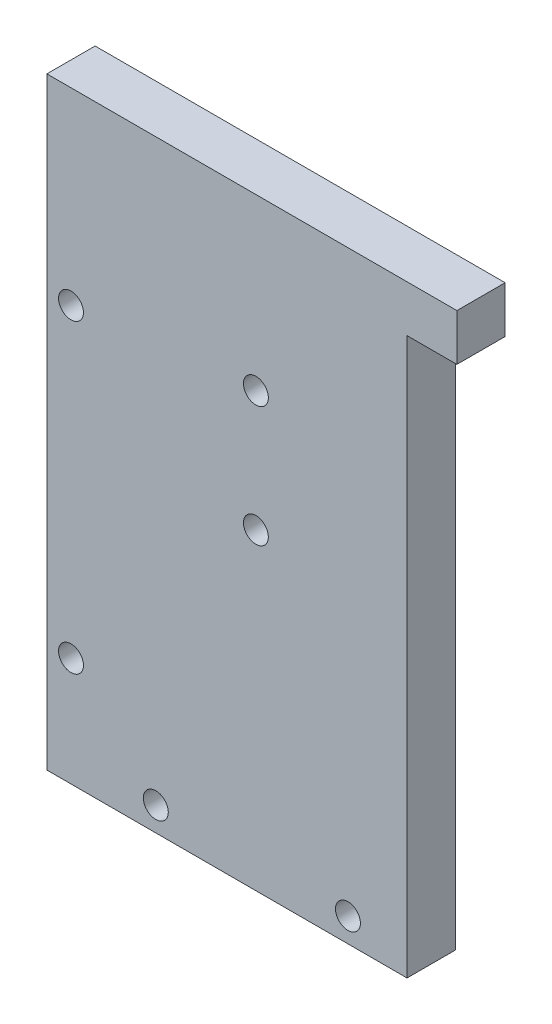
ISO-10303-21;
HEADER;
FILE_DESCRIPTION(('STEP AP214'),'2;1');
FILE_NAME('part.step','',(''),(''),'','','');
FILE_SCHEMA(('AUTOMOTIVE_DESIGN { 1 0 10303 214 1 1 1 1 }'));
ENDSEC;
DATA;
#1=APPLICATION_CONTEXT('core data for automotive mechanical design processes');
#2=APPLICATION_PROTOCOL_DEFINITION('international standard','automotive_design',2000,#1);
#3=PRODUCT_CONTEXT('',#1,'mechanical');
#4=PRODUCT('Part','Part','',(#3));
#5=PRODUCT_RELATED_PRODUCT_CATEGORY('part','',(#4));
#6=PRODUCT_DEFINITION_FORMATION('','',#4);
#7=PRODUCT_DEFINITION_CONTEXT('part definition',#1,'design');
#8=PRODUCT_DEFINITION('design','',#6,#7);
#9=PRODUCT_DEFINITION_SHAPE('','',#8);
#10=(LENGTH_UNIT() NAMED_UNIT(*) SI_UNIT(.MILLI.,.METRE.));
#11=(NAMED_UNIT(*) PLANE_ANGLE_UNIT() SI_UNIT($,.RADIAN.));
#12=(NAMED_UNIT(*) SI_UNIT($,.STERADIAN.) SOLID_ANGLE_UNIT());
#13=UNCERTAINTY_MEASURE_WITH_UNIT(LENGTH_MEASURE(1.E-05),#10,'distance_accuracy_value','');
#14=(GEOMETRIC_REPRESENTATION_CONTEXT(3) GLOBAL_UNCERTAINTY_ASSIGNED_CONTEXT((#13)) GLOBAL_UNIT_ASSIGNED_CONTEXT((#10,
#11,#12)) REPRESENTATION_CONTEXT('',''));
#15=CARTESIAN_POINT('',(0.,0.,0.));
#16=DIRECTION('',(0.,0.,1.));
#17=DIRECTION('',(1.,0.,0.));
#18=AXIS2_PLACEMENT_3D('',#15,#16,#17);
#19=CARTESIAN_POINT('',(55.4911815855497,81.,6.));
#20=DIRECTION('',(-1.,0.,0.));
#21=DIRECTION('',(0.,-1.,0.));
#22=AXIS2_PLACEMENT_3D('',#19,#20,#21);
#23=PLANE('',#22);
#24=DIRECTION('',(0.,1.,0.));
#25=VECTOR('',#24,1.);
#26=CARTESIAN_POINT('',(55.4911815855497,81.,6.));
#27=LINE('',#26,#25);
#28=CARTESIAN_POINT('',(55.4911815855497,75.2,6.));
#29=VERTEX_POINT('',#28);
#30=CARTESIAN_POINT('',(55.4911815855497,81.,6.));
#31=VERTEX_POINT('',#30);
#32=EDGE_CURVE('E78',#29,#31,#27,.T.);
#33=ORIENTED_EDGE('',*,*,#32,.F.);
#34=DIRECTION('',(0.,0.,-1.));
#35=VECTOR('',#34,1.);
#36=CARTESIAN_POINT('',(55.4911815855497,75.2,6.));
#37=LINE('',#36,#35);
#38=CARTESIAN_POINT('',(55.4911815855497,75.2,0.));
#39=VERTEX_POINT('',#38);
#40=EDGE_CURVE('E117',#29,#39,#37,.T.);
#41=ORIENTED_EDGE('',*,*,#40,.T.);
#42=DIRECTION('',(0.,1.,0.));
#43=VECTOR('',#42,1.);
#44=CARTESIAN_POINT('',(55.4911815855497,81.,0.));
#45=LINE('',#44,#43);
#46=CARTESIAN_POINT('',(55.4911815855497,81.,0.));
#47=VERTEX_POINT('',#46);
#48=EDGE_CURVE('E111',#39,#47,#45,.T.);
#49=ORIENTED_EDGE('',*,*,#48,.T.);
#50=DIRECTION('',(0.,0.,-1.));
#51=VECTOR('',#50,1.);
#52=CARTESIAN_POINT('',(55.4911815855497,81.,6.));
#53=LINE('',#52,#51);
#54=EDGE_CURVE('E41',#31,#47,#53,.T.);
#55=ORIENTED_EDGE('',*,*,#54,.F.);
#56=EDGE_LOOP('',(#33,#41,#49,#55));
#57=FACE_BOUND('',#56,.T.);
#58=ADVANCED_FACE('F34',(#57),#23,.F.);
#59=CARTESIAN_POINT('',(4.49118158554994,81.,6.));
#60=DIRECTION('',(0.,-1.,0.));
#61=DIRECTION('',(0.,0.,-1.));
#62=AXIS2_PLACEMENT_3D('',#59,#60,#61);
#63=PLANE('',#62);
#64=DIRECTION('',(-1.,0.,0.));
#65=VECTOR('',#64,1.);
#66=CARTESIAN_POINT('',(4.49118158554994,81.,0.));
#67=LINE('',#66,#65);
#68=CARTESIAN_POINT('',(4.49118158554994,81.,0.));
#69=VERTEX_POINT('',#68);
#70=EDGE_CURVE('E164',#47,#69,#67,.T.);
#71=ORIENTED_EDGE('',*,*,#70,.T.);
#72=DIRECTION('',(0.,0.,-1.));
#73=VECTOR('',#72,1.);
#74=CARTESIAN_POINT('',(4.49118158554994,81.,6.));
#75=LINE('',#74,#73);
#76=CARTESIAN_POINT('',(4.49118158554994,81.,6.));
#77=VERTEX_POINT('',#76);
#78=EDGE_CURVE('E169',#77,#69,#75,.T.);
#79=ORIENTED_EDGE('',*,*,#78,.F.);
#80=DIRECTION('',(-1.,0.,0.));
#81=VECTOR('',#80,1.);
#82=CARTESIAN_POINT('',(4.49118158554994,81.,6.));
#83=LINE('',#82,#81);
#84=EDGE_CURVE('E156',#31,#77,#83,.T.);
#85=ORIENTED_EDGE('',*,*,#84,.F.);
#86=ORIENTED_EDGE('',*,*,#54,.T.);
#87=EDGE_LOOP('',(#71,#79,#85,#86));
#88=FACE_BOUND('',#87,.T.);
#89=ADVANCED_FACE('F173',(#88),#63,.F.);
#90=CARTESIAN_POINT('',(4.49118158554994,5.99999999999996,6.));
#91=DIRECTION('',(1.,0.,0.));
#92=DIRECTION('',(0.,0.,-1.));
#93=AXIS2_PLACEMENT_3D('',#90,#91,#92);
#94=PLANE('',#93);
#95=DIRECTION('',(0.,-1.,0.));
#96=VECTOR('',#95,1.);
#97=CARTESIAN_POINT('',(4.49118158554994,5.99999999999996,0.));
#98=LINE('',#97,#96);
#99=CARTESIAN_POINT('',(4.49118158554994,5.99999999999996,0.));
#100=VERTEX_POINT('',#99);
#101=EDGE_CURVE('E73',#69,#100,#98,.T.);
#102=ORIENTED_EDGE('',*,*,#101,.T.);
#103=DIRECTION('',(0.,0.,-1.));
#104=VECTOR('',#103,1.);
#105=CARTESIAN_POINT('',(4.49118158554994,5.99999999999996,6.));
#106=LINE('',#105,#104);
#107=CARTESIAN_POINT('',(4.49118158554994,5.99999999999996,6.));
#108=VERTEX_POINT('',#107);
#109=EDGE_CURVE('E162',#108,#100,#106,.T.);
#110=ORIENTED_EDGE('',*,*,#109,.F.);
#111=DIRECTION('',(0.,-1.,0.));
#112=VECTOR('',#111,1.);
#113=CARTESIAN_POINT('',(4.49118158554994,5.99999999999996,6.));
#114=LINE('',#113,#112);
#115=EDGE_CURVE('E56',#77,#108,#114,.T.);
#116=ORIENTED_EDGE('',*,*,#115,.F.);
#117=ORIENTED_EDGE('',*,*,#78,.T.);
#118=EDGE_LOOP('',(#102,#110,#116,#117));
#119=FACE_BOUND('',#118,.T.);
#120=ADVANCED_FACE('F179',(#119),#94,.F.);
#121=CARTESIAN_POINT('',(4.49118158554994,5.99999999999996,6.));
#122=DIRECTION('',(0.,1.,0.));
#123=DIRECTION('',(-1.,0.,0.));
#124=AXIS2_PLACEMENT_3D('',#121,#122,#123);
#125=PLANE('',#124);
#126=DIRECTION('',(1.,0.,0.));
#127=VECTOR('',#126,1.);
#128=CARTESIAN_POINT('',(4.49118158554994,5.99999999999996,0.));
#129=LINE('',#128,#127);
#130=CARTESIAN_POINT('',(49.2911815855498,6.00000000000001,0.));
#131=VERTEX_POINT('',#130);
#132=EDGE_CURVE('E157',#100,#131,#129,.T.);
#133=ORIENTED_EDGE('',*,*,#132,.T.);
#134=DIRECTION('',(0.,0.,1.));
#135=VECTOR('',#134,1.);
#136=CARTESIAN_POINT('',(49.2911815855498,6.00000000000001,6.));
#137=LINE('',#136,#135);
#138=CARTESIAN_POINT('',(49.2911815855498,5.99999999999996,6.));
#139=VERTEX_POINT('',#138);
#140=EDGE_CURVE('E48',#131,#139,#137,.T.);
#141=ORIENTED_EDGE('',*,*,#140,.T.);
#142=DIRECTION('',(1.,0.,0.));
#143=VECTOR('',#142,1.);
#144=CARTESIAN_POINT('',(4.49118158554994,5.99999999999996,6.));
#145=LINE('',#144,#143);
#146=EDGE_CURVE('E160',#108,#139,#145,.T.);
#147=ORIENTED_EDGE('',*,*,#146,.F.);
#148=ORIENTED_EDGE('',*,*,#109,.T.);
#149=EDGE_LOOP('',(#133,#141,#147,#148));
#150=FACE_BOUND('',#149,.T.);
#151=ADVANCED_FACE('F177',(#150),#125,.F.);
#152=CARTESIAN_POINT('',(0.,0.,6.));
#153=DIRECTION('',(0.,0.,1.));
#154=DIRECTION('',(1.,0.,0.));
#155=AXIS2_PLACEMENT_3D('',#152,#153,#154);
#156=PLANE('',#155);
#157=DIRECTION('',(-1.,0.,0.));
#158=VECTOR('',#157,1.);
#159=CARTESIAN_POINT('',(0.,75.2,6.));
#160=LINE('',#159,#158);
#161=CARTESIAN_POINT('',(49.2911815855498,75.2,6.));
#162=VERTEX_POINT('',#161);
#163=EDGE_CURVE('E100',#29,#162,#160,.T.);
#164=ORIENTED_EDGE('',*,*,#163,.F.);
#165=ORIENTED_EDGE('',*,*,#32,.T.);
#166=ORIENTED_EDGE('',*,*,#84,.T.);
#167=ORIENTED_EDGE('',*,*,#115,.T.);
#168=ORIENTED_EDGE('',*,*,#146,.T.);
#169=DIRECTION('',(0.,-1.,0.));
#170=VECTOR('',#169,1.);
#171=CARTESIAN_POINT('',(49.2911815855498,0.,6.));
#172=LINE('',#171,#170);
#173=EDGE_CURVE('E102',#162,#139,#172,.T.);
#174=ORIENTED_EDGE('',*,*,#173,.F.);
#175=EDGE_LOOP('',(#164,#165,#166,#167,#168,#174));
#176=FACE_BOUND('',#175,.T.);
#177=CARTESIAN_POINT('',(30.4911815855496,44.8719585327784,6.));
#178=DIRECTION('',(0.,0.,-1.));
#179=DIRECTION('',(-1.,0.,0.));
#180=AXIS2_PLACEMENT_3D('',#177,#178,#179);
#181=CIRCLE('',#180,1.55);
#182=CARTESIAN_POINT('',(28.9411815855496,44.8719585327784,6.));
#183=VERTEX_POINT('',#182);
#184=EDGE_CURVE('E120',#183,#183,#181,.T.);
#185=ORIENTED_EDGE('',*,*,#184,.T.);
#186=EDGE_LOOP('',(#185));
#187=FACE_BOUND('',#186,.T.);
#188=CARTESIAN_POINT('',(30.4911815855496,59.8719585327784,6.));
#189=DIRECTION('',(0.,0.,-1.));
#190=DIRECTION('',(-1.,0.,0.));
#191=AXIS2_PLACEMENT_3D('',#188,#189,#190);
#192=CIRCLE('',#191,1.55);
#193=CARTESIAN_POINT('',(28.9411815855496,59.8719585327784,6.));
#194=VERTEX_POINT('',#193);
#195=EDGE_CURVE('E126',#194,#194,#192,.T.);
#196=ORIENTED_EDGE('',*,*,#195,.T.);
#197=EDGE_LOOP('',(#196));
#198=FACE_BOUND('',#197,.T.);
#199=CARTESIAN_POINT('',(7.49118158554989,57.5499999999999,6.));
#200=DIRECTION('',(0.,0.,-1.));
#201=DIRECTION('',(-1.,0.,0.));
#202=AXIS2_PLACEMENT_3D('',#199,#200,#201);
#203=CIRCLE('',#202,1.55);
#204=CARTESIAN_POINT('',(5.94118158554989,57.5499999999999,6.));
#205=VERTEX_POINT('',#204);
#206=EDGE_CURVE('E132',#205,#205,#203,.T.);
#207=ORIENTED_EDGE('',*,*,#206,.T.);
#208=EDGE_LOOP('',(#207));
#209=FACE_BOUND('',#208,.T.);
#210=CARTESIAN_POINT('',(7.49118158554988,19.5499999999999,6.));
#211=DIRECTION('',(0.,0.,-1.));
#212=DIRECTION('',(-1.,0.,0.));
#213=AXIS2_PLACEMENT_3D('',#210,#211,#212);
#214=CIRCLE('',#213,1.55);
#215=CARTESIAN_POINT('',(5.94118158554988,19.5499999999999,6.));
#216=VERTEX_POINT('',#215);
#217=EDGE_CURVE('E138',#216,#216,#214,.T.);
#218=ORIENTED_EDGE('',*,*,#217,.T.);
#219=EDGE_LOOP('',(#218));
#220=FACE_BOUND('',#219,.T.);
#221=CARTESIAN_POINT('',(41.9411815855499,9.00000000000003,6.));
#222=DIRECTION('',(0.,0.,-1.));
#223=DIRECTION('',(-1.,0.,0.));
#224=AXIS2_PLACEMENT_3D('',#221,#222,#223);
#225=CIRCLE('',#224,1.55);
#226=CARTESIAN_POINT('',(40.3911815855499,9.00000000000003,6.));
#227=VERTEX_POINT('',#226);
#228=EDGE_CURVE('E144',#227,#227,#225,.T.);
#229=ORIENTED_EDGE('',*,*,#228,.T.);
#230=EDGE_LOOP('',(#229));
#231=FACE_BOUND('',#230,.T.);
#232=CARTESIAN_POINT('',(18.0411815855499,9.00000000000002,6.));
#233=DIRECTION('',(0.,0.,-1.));
#234=DIRECTION('',(-1.,0.,0.));
#235=AXIS2_PLACEMENT_3D('',#232,#233,#234);
#236=CIRCLE('',#235,1.55);
#237=CARTESIAN_POINT('',(16.4911815855498,9.00000000000002,6.));
#238=VERTEX_POINT('',#237);
#239=EDGE_CURVE('E150',#238,#238,#236,.T.);
#240=ORIENTED_EDGE('',*,*,#239,.T.);
#241=EDGE_LOOP('',(#240));
#242=FACE_BOUND('',#241,.T.);
#243=ADVANCED_FACE('F186',(#176,#187,#198,#209,#220,#231,#242),#156,.T.);
#244=CARTESIAN_POINT('',(0.,0.,0.));
#245=DIRECTION('',(0.,0.,1.));
#246=DIRECTION('',(1.,0.,0.));
#247=AXIS2_PLACEMENT_3D('',#244,#245,#246);
#248=PLANE('',#247);
#249=CARTESIAN_POINT('',(30.4911815855496,44.8719585327784,0.));
#250=DIRECTION('',(0.,0.,-1.));
#251=DIRECTION('',(-1.,0.,0.));
#252=AXIS2_PLACEMENT_3D('',#249,#250,#251);
#253=CIRCLE('',#252,1.55);
#254=CARTESIAN_POINT('',(28.9411815855496,44.8719585327784,0.));
#255=VERTEX_POINT('',#254);
#256=EDGE_CURVE('E119',#255,#255,#253,.T.);
#257=ORIENTED_EDGE('',*,*,#256,.F.);
#258=EDGE_LOOP('',(#257));
#259=FACE_BOUND('',#258,.T.);
#260=CARTESIAN_POINT('',(30.4911815855496,59.8719585327784,0.));
#261=DIRECTION('',(0.,0.,-1.));
#262=DIRECTION('',(-1.,0.,0.));
#263=AXIS2_PLACEMENT_3D('',#260,#261,#262);
#264=CIRCLE('',#263,1.55);
#265=CARTESIAN_POINT('',(28.9411815855496,59.8719585327784,0.));
#266=VERTEX_POINT('',#265);
#267=EDGE_CURVE('E123',#266,#266,#264,.T.);
#268=ORIENTED_EDGE('',*,*,#267,.F.);
#269=EDGE_LOOP('',(#268));
#270=FACE_BOUND('',#269,.T.);
#271=CARTESIAN_POINT('',(7.49118158554989,57.5499999999999,0.));
#272=DIRECTION('',(0.,0.,-1.));
#273=DIRECTION('',(-1.,0.,0.));
#274=AXIS2_PLACEMENT_3D('',#271,#272,#273);
#275=CIRCLE('',#274,1.55);
#276=CARTESIAN_POINT('',(5.94118158554989,57.5499999999999,0.));
#277=VERTEX_POINT('',#276);
#278=EDGE_CURVE('E129',#277,#277,#275,.T.);
#279=ORIENTED_EDGE('',*,*,#278,.F.);
#280=EDGE_LOOP('',(#279));
#281=FACE_BOUND('',#280,.T.);
#282=CARTESIAN_POINT('',(7.49118158554988,19.5499999999999,0.));
#283=DIRECTION('',(0.,0.,-1.));
#284=DIRECTION('',(-1.,0.,0.));
#285=AXIS2_PLACEMENT_3D('',#282,#283,#284);
#286=CIRCLE('',#285,1.55);
#287=CARTESIAN_POINT('',(5.94118158554988,19.5499999999999,0.));
#288=VERTEX_POINT('',#287);
#289=EDGE_CURVE('E135',#288,#288,#286,.T.);
#290=ORIENTED_EDGE('',*,*,#289,.F.);
#291=EDGE_LOOP('',(#290));
#292=FACE_BOUND('',#291,.T.);
#293=CARTESIAN_POINT('',(41.9411815855499,9.00000000000003,0.));
#294=DIRECTION('',(0.,0.,-1.));
#295=DIRECTION('',(-1.,0.,0.));
#296=AXIS2_PLACEMENT_3D('',#293,#294,#295);
#297=CIRCLE('',#296,1.55);
#298=CARTESIAN_POINT('',(40.3911815855499,9.00000000000003,0.));
#299=VERTEX_POINT('',#298);
#300=EDGE_CURVE('E141',#299,#299,#297,.T.);
#301=ORIENTED_EDGE('',*,*,#300,.F.);
#302=EDGE_LOOP('',(#301));
#303=FACE_BOUND('',#302,.T.);
#304=CARTESIAN_POINT('',(18.0411815855499,9.00000000000002,0.));
#305=DIRECTION('',(0.,0.,-1.));
#306=DIRECTION('',(-1.,0.,0.));
#307=AXIS2_PLACEMENT_3D('',#304,#305,#306);
#308=CIRCLE('',#307,1.55);
#309=CARTESIAN_POINT('',(16.4911815855498,9.00000000000002,0.));
#310=VERTEX_POINT('',#309);
#311=EDGE_CURVE('E147',#310,#310,#308,.T.);
#312=ORIENTED_EDGE('',*,*,#311,.F.);
#313=EDGE_LOOP('',(#312));
#314=FACE_BOUND('',#313,.T.);
#315=ORIENTED_EDGE('',*,*,#48,.F.);
#316=DIRECTION('',(1.,0.,0.));
#317=VECTOR('',#316,1.);
#318=CARTESIAN_POINT('',(55.6911815855497,75.2,0.));
#319=LINE('',#318,#317);
#320=CARTESIAN_POINT('',(49.2911815855498,75.2,0.));
#321=VERTEX_POINT('',#320);
#322=EDGE_CURVE('E98',#321,#39,#319,.T.);
#323=ORIENTED_EDGE('',*,*,#322,.F.);
#324=DIRECTION('',(0.,-1.,0.));
#325=VECTOR('',#324,1.);
#326=CARTESIAN_POINT('',(49.2911815855498,0.,0.));
#327=LINE('',#326,#325);
#328=EDGE_CURVE('E11',#321,#131,#327,.T.);
#329=ORIENTED_EDGE('',*,*,#328,.T.);
#330=ORIENTED_EDGE('',*,*,#132,.F.);
#331=ORIENTED_EDGE('',*,*,#101,.F.);
#332=ORIENTED_EDGE('',*,*,#70,.F.);
#333=EDGE_LOOP('',(#315,#323,#329,#330,#331,#332));
#334=FACE_BOUND('',#333,.T.);
#335=ADVANCED_FACE('F109',(#259,#270,#281,#292,#303,#314,#334),#248,.F.);
#336=CARTESIAN_POINT('',(18.0411815855499,9.00000000000002,6.));
#337=DIRECTION('',(0.,0.,-1.));
#338=DIRECTION('',(-1.,0.,0.));
#339=AXIS2_PLACEMENT_3D('',#336,#337,#338);
#340=CYLINDRICAL_SURFACE('',#339,1.55);
#341=ORIENTED_EDGE('',*,*,#239,.F.);
#342=EDGE_LOOP('',(#341));
#343=FACE_BOUND('',#342,.T.);
#344=ORIENTED_EDGE('',*,*,#311,.T.);
#345=EDGE_LOOP('',(#344));
#346=FACE_BOUND('',#345,.T.);
#347=ADVANCED_FACE('F207',(#343,#346),#340,.F.);
#348=CARTESIAN_POINT('',(41.9411815855499,9.00000000000003,6.));
#349=DIRECTION('',(0.,0.,-1.));
#350=DIRECTION('',(-1.,0.,0.));
#351=AXIS2_PLACEMENT_3D('',#348,#349,#350);
#352=CYLINDRICAL_SURFACE('',#351,1.55);
#353=ORIENTED_EDGE('',*,*,#228,.F.);
#354=EDGE_LOOP('',(#353));
#355=FACE_BOUND('',#354,.T.);
#356=ORIENTED_EDGE('',*,*,#300,.T.);
#357=EDGE_LOOP('',(#356));
#358=FACE_BOUND('',#357,.T.);
#359=ADVANCED_FACE('F212',(#355,#358),#352,.F.);
#360=CARTESIAN_POINT('',(7.49118158554988,19.5499999999999,6.));
#361=DIRECTION('',(0.,0.,-1.));
#362=DIRECTION('',(-1.,0.,0.));
#363=AXIS2_PLACEMENT_3D('',#360,#361,#362);
#364=CYLINDRICAL_SURFACE('',#363,1.55);
#365=ORIENTED_EDGE('',*,*,#217,.F.);
#366=EDGE_LOOP('',(#365));
#367=FACE_BOUND('',#366,.T.);
#368=ORIENTED_EDGE('',*,*,#289,.T.);
#369=EDGE_LOOP('',(#368));
#370=FACE_BOUND('',#369,.T.);
#371=ADVANCED_FACE('F224',(#367,#370),#364,.F.);
#372=CARTESIAN_POINT('',(7.49118158554989,57.5499999999999,6.));
#373=DIRECTION('',(0.,0.,-1.));
#374=DIRECTION('',(-1.,0.,0.));
#375=AXIS2_PLACEMENT_3D('',#372,#373,#374);
#376=CYLINDRICAL_SURFACE('',#375,1.55);
#377=ORIENTED_EDGE('',*,*,#206,.F.);
#378=EDGE_LOOP('',(#377));
#379=FACE_BOUND('',#378,.T.);
#380=ORIENTED_EDGE('',*,*,#278,.T.);
#381=EDGE_LOOP('',(#380));
#382=FACE_BOUND('',#381,.T.);
#383=ADVANCED_FACE('F234',(#379,#382),#376,.F.);
#384=CARTESIAN_POINT('',(30.4911815855496,59.8719585327784,6.));
#385=DIRECTION('',(0.,0.,-1.));
#386=DIRECTION('',(-1.,0.,0.));
#387=AXIS2_PLACEMENT_3D('',#384,#385,#386);
#388=CYLINDRICAL_SURFACE('',#387,1.55);
#389=ORIENTED_EDGE('',*,*,#195,.F.);
#390=EDGE_LOOP('',(#389));
#391=FACE_BOUND('',#390,.T.);
#392=ORIENTED_EDGE('',*,*,#267,.T.);
#393=EDGE_LOOP('',(#392));
#394=FACE_BOUND('',#393,.T.);
#395=ADVANCED_FACE('F244',(#391,#394),#388,.F.);
#396=CARTESIAN_POINT('',(30.4911815855496,44.8719585327784,6.));
#397=DIRECTION('',(0.,0.,-1.));
#398=DIRECTION('',(-1.,0.,0.));
#399=AXIS2_PLACEMENT_3D('',#396,#397,#398);
#400=CYLINDRICAL_SURFACE('',#399,1.55);
#401=ORIENTED_EDGE('',*,*,#184,.F.);
#402=EDGE_LOOP('',(#401));
#403=FACE_BOUND('',#402,.T.);
#404=ORIENTED_EDGE('',*,*,#256,.T.);
#405=EDGE_LOOP('',(#404));
#406=FACE_BOUND('',#405,.T.);
#407=ADVANCED_FACE('F253',(#403,#406),#400,.F.);
#408=CARTESIAN_POINT('',(55.6911815855497,75.2,10.));
#409=DIRECTION('',(0.,1.,0.));
#410=DIRECTION('',(0.,0.,1.));
#411=AXIS2_PLACEMENT_3D('',#408,#409,#410);
#412=PLANE('',#411);
#413=ORIENTED_EDGE('',*,*,#163,.T.);
#414=DIRECTION('',(0.,0.,-1.));
#415=VECTOR('',#414,1.);
#416=CARTESIAN_POINT('',(49.2911815855498,75.2,10.));
#417=LINE('',#416,#415);
#418=EDGE_CURVE('E95',#162,#321,#417,.T.);
#419=ORIENTED_EDGE('',*,*,#418,.T.);
#420=ORIENTED_EDGE('',*,*,#322,.T.);
#421=ORIENTED_EDGE('',*,*,#40,.F.);
#422=EDGE_LOOP('',(#413,#419,#420,#421));
#423=FACE_BOUND('',#422,.T.);
#424=ADVANCED_FACE('F96',(#423),#412,.F.);
#425=CARTESIAN_POINT('',(49.2911815855498,5.80000000000001,10.));
#426=DIRECTION('',(-1.,0.,0.));
#427=DIRECTION('',(0.,0.,1.));
#428=AXIS2_PLACEMENT_3D('',#425,#426,#427);
#429=PLANE('',#428);
#430=ORIENTED_EDGE('',*,*,#328,.F.);
#431=ORIENTED_EDGE('',*,*,#418,.F.);
#432=ORIENTED_EDGE('',*,*,#173,.T.);
#433=ORIENTED_EDGE('',*,*,#140,.F.);
#434=EDGE_LOOP('',(#430,#431,#432,#433));
#435=FACE_BOUND('',#434,.T.);
#436=ADVANCED_FACE('F104',(#435),#429,.F.);
#437=CLOSED_SHELL('',(#58,#89,#120,#151,#243,#335,#347,#359,#371,#383,#395,#407,#424,#436));
#438=MANIFOLD_SOLID_BREP('B2',#437);
#439=ADVANCED_BREP_SHAPE_REPRESENTATION('',(#18,#438),#14);
#440=SHAPE_DEFINITION_REPRESENTATION(#9,#439);
ENDSEC;
END-ISO-10303-21;
